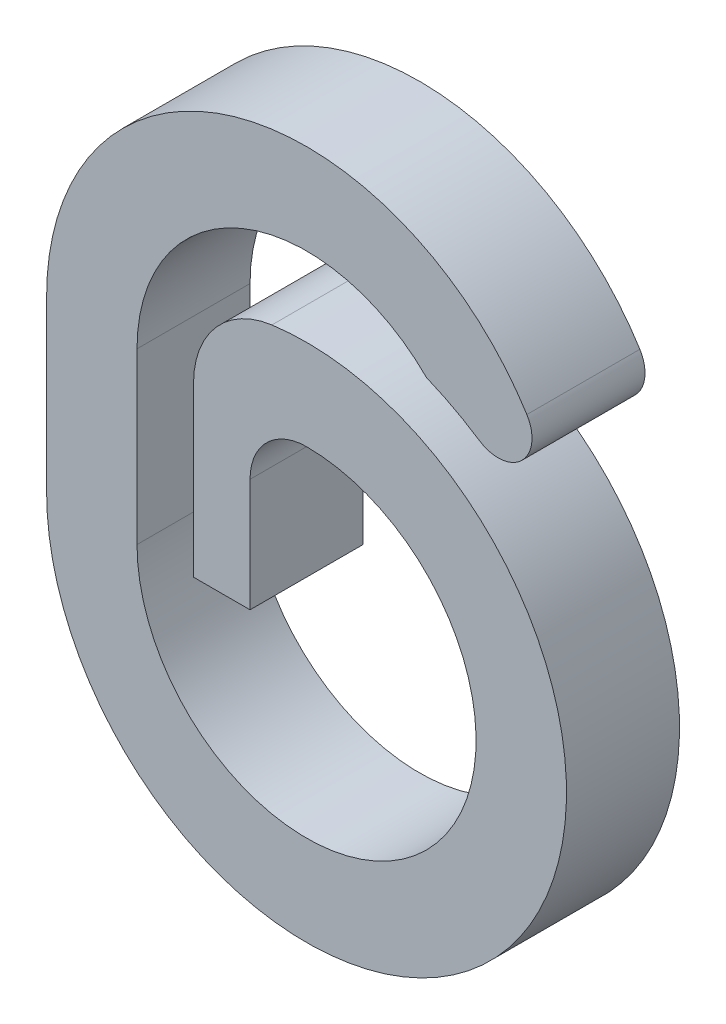
ISO-10303-21;
HEADER;
FILE_DESCRIPTION(('STEP AP214'),'2;1');
FILE_NAME('part.step','',(''),(''),'','','');
FILE_SCHEMA(('AUTOMOTIVE_DESIGN { 1 0 10303 214 1 1 1 1 }'));
ENDSEC;
DATA;
#1=APPLICATION_CONTEXT('core data for automotive mechanical design processes');
#2=APPLICATION_PROTOCOL_DEFINITION('international standard','automotive_design',2000,#1);
#3=PRODUCT_CONTEXT('',#1,'mechanical');
#4=PRODUCT('Part','Part','',(#3));
#5=PRODUCT_RELATED_PRODUCT_CATEGORY('part','',(#4));
#6=PRODUCT_DEFINITION_FORMATION('','',#4);
#7=PRODUCT_DEFINITION_CONTEXT('part definition',#1,'design');
#8=PRODUCT_DEFINITION('design','',#6,#7);
#9=PRODUCT_DEFINITION_SHAPE('','',#8);
#10=(LENGTH_UNIT() NAMED_UNIT(*) SI_UNIT(.MILLI.,.METRE.));
#11=(NAMED_UNIT(*) PLANE_ANGLE_UNIT() SI_UNIT($,.RADIAN.));
#12=(NAMED_UNIT(*) SI_UNIT($,.STERADIAN.) SOLID_ANGLE_UNIT());
#13=UNCERTAINTY_MEASURE_WITH_UNIT(LENGTH_MEASURE(1.E-05),#10,'distance_accuracy_value','');
#14=(GEOMETRIC_REPRESENTATION_CONTEXT(3) GLOBAL_UNCERTAINTY_ASSIGNED_CONTEXT((#13)) GLOBAL_UNIT_ASSIGNED_CONTEXT((#10,
#11,#12)) REPRESENTATION_CONTEXT('',''));
#15=CARTESIAN_POINT('',(0.,0.,0.));
#16=DIRECTION('',(0.,0.,1.));
#17=DIRECTION('',(1.,0.,0.));
#18=AXIS2_PLACEMENT_3D('',#15,#16,#17);
#19=CARTESIAN_POINT('',(-5.,0.,10.));
#20=DIRECTION('',(-1.,0.,0.));
#21=DIRECTION('',(0.,-1.,0.));
#22=AXIS2_PLACEMENT_3D('',#19,#20,#21);
#23=PLANE('',#22);
#24=DIRECTION('',(0.,1.,0.));
#25=VECTOR('',#24,1.);
#26=CARTESIAN_POINT('',(-5.,0.,0.));
#27=LINE('',#26,#25);
#28=CARTESIAN_POINT('',(-5.,0.,0.));
#29=VERTEX_POINT('',#28);
#30=CARTESIAN_POINT('',(-5.,10.,0.));
#31=VERTEX_POINT('',#30);
#32=EDGE_CURVE('E159',#29,#31,#27,.T.);
#33=ORIENTED_EDGE('',*,*,#32,.T.);
#34=DIRECTION('',(0.,0.,-1.));
#35=VECTOR('',#34,1.);
#36=CARTESIAN_POINT('',(-5.,10.,10.));
#37=LINE('',#36,#35);
#38=CARTESIAN_POINT('',(-5.,10.,10.));
#39=VERTEX_POINT('',#38);
#40=EDGE_CURVE('E11',#39,#31,#37,.T.);
#41=ORIENTED_EDGE('',*,*,#40,.F.);
#42=DIRECTION('',(0.,1.,0.));
#43=VECTOR('',#42,1.);
#44=CARTESIAN_POINT('',(-5.,0.,10.));
#45=LINE('',#44,#43);
#46=CARTESIAN_POINT('',(-5.,0.,10.));
#47=VERTEX_POINT('',#46);
#48=EDGE_CURVE('E183',#47,#39,#45,.T.);
#49=ORIENTED_EDGE('',*,*,#48,.F.);
#50=DIRECTION('',(0.,0.,-1.));
#51=VECTOR('',#50,1.);
#52=CARTESIAN_POINT('',(-5.,0.,10.));
#53=LINE('',#52,#51);
#54=EDGE_CURVE('E155',#47,#29,#53,.T.);
#55=ORIENTED_EDGE('',*,*,#54,.T.);
#56=EDGE_LOOP('',(#33,#41,#49,#55));
#57=FACE_BOUND('',#56,.T.);
#58=ADVANCED_FACE('F33',(#57),#23,.F.);
#59=CARTESIAN_POINT('',(0.,10.,10.));
#60=DIRECTION('',(0.,0.,-1.));
#61=DIRECTION('',(-1.,0.,0.));
#62=AXIS2_PLACEMENT_3D('',#59,#60,#61);
#63=CYLINDRICAL_SURFACE('',#62,5.);
#64=CARTESIAN_POINT('',(0.,10.,0.));
#65=DIRECTION('',(0.,0.,-1.));
#66=DIRECTION('',(1.,0.,0.));
#67=AXIS2_PLACEMENT_3D('',#64,#65,#66);
#68=CIRCLE('',#67,5.);
#69=CARTESIAN_POINT('',(0.,15.,0.));
#70=VERTEX_POINT('',#69);
#71=EDGE_CURVE('E162',#31,#70,#68,.T.);
#72=ORIENTED_EDGE('',*,*,#71,.T.);
#73=DIRECTION('',(0.,0.,-1.));
#74=VECTOR('',#73,1.);
#75=CARTESIAN_POINT('',(0.,15.,10.));
#76=LINE('',#75,#74);
#77=CARTESIAN_POINT('',(0.,15.,10.));
#78=VERTEX_POINT('',#77);
#79=EDGE_CURVE('E41',#78,#70,#76,.T.);
#80=ORIENTED_EDGE('',*,*,#79,.F.);
#81=CARTESIAN_POINT('',(0.,10.,10.));
#82=DIRECTION('',(0.,0.,-1.));
#83=DIRECTION('',(1.,0.,0.));
#84=AXIS2_PLACEMENT_3D('',#81,#82,#83);
#85=CIRCLE('',#84,5.);
#86=EDGE_CURVE('E106',#39,#78,#85,.T.);
#87=ORIENTED_EDGE('',*,*,#86,.F.);
#88=ORIENTED_EDGE('',*,*,#40,.T.);
#89=EDGE_LOOP('',(#72,#80,#87,#88));
#90=FACE_BOUND('',#89,.T.);
#91=ADVANCED_FACE('F266',(#90),#63,.F.);
#92=CARTESIAN_POINT('',(0.,0.,10.));
#93=DIRECTION('',(0.,0.,-1.));
#94=DIRECTION('',(-1.,0.,0.));
#95=AXIS2_PLACEMENT_3D('',#92,#93,#94);
#96=CYLINDRICAL_SURFACE('',#95,15.);
#97=CARTESIAN_POINT('',(0.,0.,0.));
#98=DIRECTION('',(0.,0.,-1.));
#99=DIRECTION('',(1.,0.,0.));
#100=AXIS2_PLACEMENT_3D('',#97,#98,#99);
#101=CIRCLE('',#100,15.);
#102=CARTESIAN_POINT('',(-15.,0.,0.));
#103=VERTEX_POINT('',#102);
#104=EDGE_CURVE('E164',#70,#103,#101,.T.);
#105=ORIENTED_EDGE('',*,*,#104,.T.);
#106=DIRECTION('',(0.,0.,-1.));
#107=VECTOR('',#106,1.);
#108=CARTESIAN_POINT('',(-15.,0.,10.));
#109=LINE('',#108,#107);
#110=CARTESIAN_POINT('',(-15.,0.,10.));
#111=VERTEX_POINT('',#110);
#112=EDGE_CURVE('E205',#111,#103,#109,.T.);
#113=ORIENTED_EDGE('',*,*,#112,.F.);
#114=CARTESIAN_POINT('',(0.,0.,10.));
#115=DIRECTION('',(0.,0.,-1.));
#116=DIRECTION('',(1.,0.,0.));
#117=AXIS2_PLACEMENT_3D('',#114,#115,#116);
#118=CIRCLE('',#117,15.);
#119=EDGE_CURVE('E213',#78,#111,#118,.T.);
#120=ORIENTED_EDGE('',*,*,#119,.F.);
#121=ORIENTED_EDGE('',*,*,#79,.T.);
#122=EDGE_LOOP('',(#105,#113,#120,#121));
#123=FACE_BOUND('',#122,.T.);
#124=ADVANCED_FACE('F211',(#123),#96,.F.);
#125=CARTESIAN_POINT('',(-15.,15.,10.));
#126=DIRECTION('',(-1.,0.,0.));
#127=DIRECTION('',(0.,0.,1.));
#128=AXIS2_PLACEMENT_3D('',#125,#126,#127);
#129=PLANE('',#128);
#130=DIRECTION('',(0.,1.,0.));
#131=VECTOR('',#130,1.);
#132=CARTESIAN_POINT('',(-15.,15.,0.));
#133=LINE('',#132,#131);
#134=CARTESIAN_POINT('',(-15.,15.,0.));
#135=VERTEX_POINT('',#134);
#136=EDGE_CURVE('E166',#103,#135,#133,.T.);
#137=ORIENTED_EDGE('',*,*,#136,.T.);
#138=DIRECTION('',(0.,0.,-1.));
#139=VECTOR('',#138,1.);
#140=CARTESIAN_POINT('',(-15.,15.,10.));
#141=LINE('',#140,#139);
#142=CARTESIAN_POINT('',(-15.,15.,10.));
#143=VERTEX_POINT('',#142);
#144=EDGE_CURVE('E202',#143,#135,#141,.T.);
#145=ORIENTED_EDGE('',*,*,#144,.F.);
#146=DIRECTION('',(0.,1.,0.));
#147=VECTOR('',#146,1.);
#148=CARTESIAN_POINT('',(-15.,15.,10.));
#149=LINE('',#148,#147);
#150=EDGE_CURVE('E231',#111,#143,#149,.T.);
#151=ORIENTED_EDGE('',*,*,#150,.F.);
#152=ORIENTED_EDGE('',*,*,#112,.T.);
#153=EDGE_LOOP('',(#137,#145,#151,#152));
#154=FACE_BOUND('',#153,.T.);
#155=ADVANCED_FACE('F222',(#154),#129,.F.);
#156=CARTESIAN_POINT('',(0.,15.,10.));
#157=DIRECTION('',(0.,0.,-1.));
#158=DIRECTION('',(-1.,0.,0.));
#159=AXIS2_PLACEMENT_3D('',#156,#157,#158);
#160=CYLINDRICAL_SURFACE('',#159,15.);
#161=CARTESIAN_POINT('',(0.,15.,0.));
#162=DIRECTION('',(0.,0.,-1.));
#163=DIRECTION('',(1.,0.,0.));
#164=AXIS2_PLACEMENT_3D('',#161,#162,#163);
#165=CIRCLE('',#164,15.);
#166=CARTESIAN_POINT('',(10.6066017177982,25.6066017177982,0.));
#167=VERTEX_POINT('',#166);
#168=EDGE_CURVE('E168',#135,#167,#165,.T.);
#169=ORIENTED_EDGE('',*,*,#168,.T.);
#170=DIRECTION('',(0.,0.,-1.));
#171=VECTOR('',#170,1.);
#172=CARTESIAN_POINT('',(10.6066017177982,25.6066017177982,10.));
#173=LINE('',#172,#171);
#174=CARTESIAN_POINT('',(10.6066017177982,25.6066017177982,10.));
#175=VERTEX_POINT('',#174);
#176=EDGE_CURVE('E199',#175,#167,#173,.T.);
#177=ORIENTED_EDGE('',*,*,#176,.F.);
#178=CARTESIAN_POINT('',(0.,15.,10.));
#179=DIRECTION('',(0.,0.,-1.));
#180=DIRECTION('',(1.,0.,0.));
#181=AXIS2_PLACEMENT_3D('',#178,#179,#180);
#182=CIRCLE('',#181,15.);
#183=EDGE_CURVE('E228',#143,#175,#182,.T.);
#184=ORIENTED_EDGE('',*,*,#183,.F.);
#185=ORIENTED_EDGE('',*,*,#144,.T.);
#186=EDGE_LOOP('',(#169,#177,#184,#185));
#187=FACE_BOUND('',#186,.T.);
#188=ADVANCED_FACE('F226',(#187),#160,.F.);
#189=CARTESIAN_POINT('',(0.,0.,10.));
#190=DIRECTION('',(0.,0.,-1.));
#191=DIRECTION('',(-1.,0.,0.));
#192=AXIS2_PLACEMENT_3D('',#189,#190,#191);
#193=CYLINDRICAL_SURFACE('',#192,27.7163859753386);
#194=CARTESIAN_POINT('',(0.,0.,0.));
#195=DIRECTION('',(0.,0.,-1.));
#196=DIRECTION('',(1.,0.,0.));
#197=AXIS2_PLACEMENT_3D('',#194,#195,#196);
#198=CIRCLE('',#197,27.7163859753386);
#199=CARTESIAN_POINT('',(15.2941714006203,23.114635465488,0.));
#200=VERTEX_POINT('',#199);
#201=EDGE_CURVE('E170',#167,#200,#198,.T.);
#202=ORIENTED_EDGE('',*,*,#201,.T.);
#203=DIRECTION('',(0.,0.,-1.));
#204=VECTOR('',#203,1.);
#205=CARTESIAN_POINT('',(15.2941714006203,23.114635465488,10.));
#206=LINE('',#205,#204);
#207=CARTESIAN_POINT('',(15.2941714006203,23.114635465488,10.));
#208=VERTEX_POINT('',#207);
#209=EDGE_CURVE('E196',#208,#200,#206,.T.);
#210=ORIENTED_EDGE('',*,*,#209,.F.);
#211=CARTESIAN_POINT('',(0.,0.,10.));
#212=DIRECTION('',(0.,0.,-1.));
#213=DIRECTION('',(1.,0.,0.));
#214=AXIS2_PLACEMENT_3D('',#211,#212,#213);
#215=CIRCLE('',#214,27.7163859753386);
#216=EDGE_CURVE('E230',#175,#208,#215,.T.);
#217=ORIENTED_EDGE('',*,*,#216,.F.);
#218=ORIENTED_EDGE('',*,*,#176,.T.);
#219=EDGE_LOOP('',(#202,#210,#217,#218));
#220=FACE_BOUND('',#219,.T.);
#221=ADVANCED_FACE('F279',(#220),#193,.F.);
#222=CARTESIAN_POINT('',(16.9496005840169,25.6165455795326,10.));
#223=DIRECTION('',(0.,0.,-1.));
#224=DIRECTION('',(-1.,0.,0.));
#225=AXIS2_PLACEMENT_3D('',#222,#223,#224);
#226=CYLINDRICAL_SURFACE('',#225,3.);
#227=CARTESIAN_POINT('',(16.9496005840169,25.6165455795326,0.));
#228=DIRECTION('',(0.,0.,1.));
#229=DIRECTION('',(1.,0.,0.));
#230=AXIS2_PLACEMENT_3D('',#227,#228,#229);
#231=CIRCLE('',#230,3.);
#232=CARTESIAN_POINT('',(19.4920406716195,27.2090274164625,0.));
#233=VERTEX_POINT('',#232);
#234=EDGE_CURVE('E172',#200,#233,#231,.T.);
#235=ORIENTED_EDGE('',*,*,#234,.T.);
#236=DIRECTION('',(0.,0.,-1.));
#237=VECTOR('',#236,1.);
#238=CARTESIAN_POINT('',(19.4920406716195,27.2090274164625,10.));
#239=LINE('',#238,#237);
#240=CARTESIAN_POINT('',(19.4920406716195,27.2090274164625,10.));
#241=VERTEX_POINT('',#240);
#242=EDGE_CURVE('E193',#241,#233,#239,.T.);
#243=ORIENTED_EDGE('',*,*,#242,.F.);
#244=CARTESIAN_POINT('',(16.9496005840169,25.6165455795326,10.));
#245=DIRECTION('',(0.,0.,1.));
#246=DIRECTION('',(1.,0.,0.));
#247=AXIS2_PLACEMENT_3D('',#244,#245,#246);
#248=CIRCLE('',#247,3.);
#249=EDGE_CURVE('E233',#208,#241,#248,.T.);
#250=ORIENTED_EDGE('',*,*,#249,.F.);
#251=ORIENTED_EDGE('',*,*,#209,.T.);
#252=EDGE_LOOP('',(#235,#243,#250,#251));
#253=FACE_BOUND('',#252,.T.);
#254=ADVANCED_FACE('F282',(#253),#226,.T.);
#255=CARTESIAN_POINT('',(0.,15.,10.));
#256=DIRECTION('',(0.,0.,-1.));
#257=DIRECTION('',(-1.,0.,0.));
#258=AXIS2_PLACEMENT_3D('',#255,#256,#257);
#259=CYLINDRICAL_SURFACE('',#258,23.);
#260=CARTESIAN_POINT('',(0.,15.,0.));
#261=DIRECTION('',(0.,0.,1.));
#262=DIRECTION('',(1.,0.,0.));
#263=AXIS2_PLACEMENT_3D('',#260,#261,#262);
#264=CIRCLE('',#263,23.);
#265=CARTESIAN_POINT('',(-23.,15.,0.));
#266=VERTEX_POINT('',#265);
#267=EDGE_CURVE('E174',#233,#266,#264,.T.);
#268=ORIENTED_EDGE('',*,*,#267,.T.);
#269=DIRECTION('',(0.,0.,-1.));
#270=VECTOR('',#269,1.);
#271=CARTESIAN_POINT('',(-23.,15.,10.));
#272=LINE('',#271,#270);
#273=CARTESIAN_POINT('',(-23.,15.,10.));
#274=VERTEX_POINT('',#273);
#275=EDGE_CURVE('E190',#274,#266,#272,.T.);
#276=ORIENTED_EDGE('',*,*,#275,.F.);
#277=CARTESIAN_POINT('',(0.,15.,10.));
#278=DIRECTION('',(0.,0.,1.));
#279=DIRECTION('',(1.,0.,0.));
#280=AXIS2_PLACEMENT_3D('',#277,#278,#279);
#281=CIRCLE('',#280,23.);
#282=EDGE_CURVE('E239',#241,#274,#281,.T.);
#283=ORIENTED_EDGE('',*,*,#282,.F.);
#284=ORIENTED_EDGE('',*,*,#242,.T.);
#285=EDGE_LOOP('',(#268,#276,#283,#284));
#286=FACE_BOUND('',#285,.T.);
#287=ADVANCED_FACE('F286',(#286),#259,.T.);
#288=CARTESIAN_POINT('',(-23.,0.,10.));
#289=DIRECTION('',(1.,0.,0.));
#290=DIRECTION('',(0.,1.,0.));
#291=AXIS2_PLACEMENT_3D('',#288,#289,#290);
#292=PLANE('',#291);
#293=DIRECTION('',(0.,-1.,0.));
#294=VECTOR('',#293,1.);
#295=CARTESIAN_POINT('',(-23.,0.,0.));
#296=LINE('',#295,#294);
#297=CARTESIAN_POINT('',(-23.,0.,0.));
#298=VERTEX_POINT('',#297);
#299=EDGE_CURVE('E176',#266,#298,#296,.T.);
#300=ORIENTED_EDGE('',*,*,#299,.T.);
#301=DIRECTION('',(0.,0.,-1.));
#302=VECTOR('',#301,1.);
#303=CARTESIAN_POINT('',(-23.,0.,10.));
#304=LINE('',#303,#302);
#305=CARTESIAN_POINT('',(-23.,0.,10.));
#306=VERTEX_POINT('',#305);
#307=EDGE_CURVE('E187',#306,#298,#304,.T.);
#308=ORIENTED_EDGE('',*,*,#307,.F.);
#309=DIRECTION('',(0.,-1.,0.));
#310=VECTOR('',#309,1.);
#311=CARTESIAN_POINT('',(-23.,0.,10.));
#312=LINE('',#311,#310);
#313=EDGE_CURVE('E241',#274,#306,#312,.T.);
#314=ORIENTED_EDGE('',*,*,#313,.F.);
#315=ORIENTED_EDGE('',*,*,#275,.T.);
#316=EDGE_LOOP('',(#300,#308,#314,#315));
#317=FACE_BOUND('',#316,.T.);
#318=ADVANCED_FACE('F247',(#317),#292,.F.);
#319=CARTESIAN_POINT('',(0.,0.,10.));
#320=DIRECTION('',(0.,0.,-1.));
#321=DIRECTION('',(-1.,0.,0.));
#322=AXIS2_PLACEMENT_3D('',#319,#320,#321);
#323=CYLINDRICAL_SURFACE('',#322,23.);
#324=CARTESIAN_POINT('',(0.,0.,0.));
#325=DIRECTION('',(0.,0.,1.));
#326=DIRECTION('',(1.,0.,0.));
#327=AXIS2_PLACEMENT_3D('',#324,#325,#326);
#328=CIRCLE('',#327,23.);
#329=CARTESIAN_POINT('',(-3.06666666666667,22.7946387458884,0.));
#330=VERTEX_POINT('',#329);
#331=EDGE_CURVE('E178',#298,#330,#328,.T.);
#332=ORIENTED_EDGE('',*,*,#331,.T.);
#333=DIRECTION('',(0.,0.,-1.));
#334=VECTOR('',#333,1.);
#335=CARTESIAN_POINT('',(-3.06666666666667,22.7946387458884,10.));
#336=LINE('',#335,#334);
#337=CARTESIAN_POINT('',(-3.06666666666667,22.7946387458884,10.));
#338=VERTEX_POINT('',#337);
#339=EDGE_CURVE('E150',#338,#330,#336,.T.);
#340=ORIENTED_EDGE('',*,*,#339,.F.);
#341=CARTESIAN_POINT('',(0.,0.,10.));
#342=DIRECTION('',(0.,0.,1.));
#343=DIRECTION('',(1.,0.,0.));
#344=AXIS2_PLACEMENT_3D('',#341,#342,#343);
#345=CIRCLE('',#344,23.);
#346=EDGE_CURVE('E140',#306,#338,#345,.T.);
#347=ORIENTED_EDGE('',*,*,#346,.F.);
#348=ORIENTED_EDGE('',*,*,#307,.T.);
#349=EDGE_LOOP('',(#332,#340,#347,#348));
#350=FACE_BOUND('',#349,.T.);
#351=ADVANCED_FACE('F251',(#350),#323,.T.);
#352=CARTESIAN_POINT('',(-2.,14.8660687473185,10.));
#353=DIRECTION('',(0.,0.,-1.));
#354=DIRECTION('',(-1.,0.,0.));
#355=AXIS2_PLACEMENT_3D('',#352,#353,#354);
#356=CYLINDRICAL_SURFACE('',#355,8.);
#357=CARTESIAN_POINT('',(-2.,14.8660687473185,0.));
#358=DIRECTION('',(0.,0.,1.));
#359=DIRECTION('',(-1.,0.,0.));
#360=AXIS2_PLACEMENT_3D('',#357,#358,#359);
#361=CIRCLE('',#360,8.);
#362=CARTESIAN_POINT('',(-10.,14.8660687473185,0.));
#363=VERTEX_POINT('',#362);
#364=EDGE_CURVE('E149',#330,#363,#361,.T.);
#365=ORIENTED_EDGE('',*,*,#364,.T.);
#366=DIRECTION('',(0.,0.,-1.));
#367=VECTOR('',#366,1.);
#368=CARTESIAN_POINT('',(-10.,14.8660687473185,10.));
#369=LINE('',#368,#367);
#370=CARTESIAN_POINT('',(-10.,14.8660687473185,10.));
#371=VERTEX_POINT('',#370);
#372=EDGE_CURVE('E146',#371,#363,#369,.T.);
#373=ORIENTED_EDGE('',*,*,#372,.F.);
#374=CARTESIAN_POINT('',(-2.,14.8660687473185,10.));
#375=DIRECTION('',(0.,0.,1.));
#376=DIRECTION('',(-1.,0.,0.));
#377=AXIS2_PLACEMENT_3D('',#374,#375,#376);
#378=CIRCLE('',#377,8.);
#379=EDGE_CURVE('E134',#338,#371,#378,.T.);
#380=ORIENTED_EDGE('',*,*,#379,.F.);
#381=ORIENTED_EDGE('',*,*,#339,.T.);
#382=EDGE_LOOP('',(#365,#373,#380,#381));
#383=FACE_BOUND('',#382,.T.);
#384=ADVANCED_FACE('F147',(#383),#356,.T.);
#385=CARTESIAN_POINT('',(-10.,11.1803398874989,10.));
#386=DIRECTION('',(1.,0.,0.));
#387=DIRECTION('',(0.,1.,0.));
#388=AXIS2_PLACEMENT_3D('',#385,#386,#387);
#389=PLANE('',#388);
#390=DIRECTION('',(0.,-1.,0.));
#391=VECTOR('',#390,1.);
#392=CARTESIAN_POINT('',(-10.,11.1803398874989,0.));
#393=LINE('',#392,#391);
#394=CARTESIAN_POINT('',(-10.,0.,0.));
#395=VERTEX_POINT('',#394);
#396=EDGE_CURVE('E92',#363,#395,#393,.T.);
#397=ORIENTED_EDGE('',*,*,#396,.T.);
#398=DIRECTION('',(0.,0.,-1.));
#399=VECTOR('',#398,1.);
#400=CARTESIAN_POINT('',(-10.,0.,10.));
#401=LINE('',#400,#399);
#402=CARTESIAN_POINT('',(-10.,0.,10.));
#403=VERTEX_POINT('',#402);
#404=EDGE_CURVE('E151',#403,#395,#401,.T.);
#405=ORIENTED_EDGE('',*,*,#404,.F.);
#406=DIRECTION('',(0.,-1.,0.));
#407=VECTOR('',#406,1.);
#408=CARTESIAN_POINT('',(-10.,14.8660687473185,10.));
#409=LINE('',#408,#407);
#410=EDGE_CURVE('E138',#371,#403,#409,.T.);
#411=ORIENTED_EDGE('',*,*,#410,.F.);
#412=ORIENTED_EDGE('',*,*,#372,.T.);
#413=EDGE_LOOP('',(#397,#405,#411,#412));
#414=FACE_BOUND('',#413,.T.);
#415=ADVANCED_FACE('F153',(#414),#389,.F.);
#416=CARTESIAN_POINT('',(-10.,0.,10.));
#417=DIRECTION('',(0.,1.,0.));
#418=DIRECTION('',(0.,0.,1.));
#419=AXIS2_PLACEMENT_3D('',#416,#417,#418);
#420=PLANE('',#419);
#421=DIRECTION('',(1.,0.,0.));
#422=VECTOR('',#421,1.);
#423=CARTESIAN_POINT('',(-10.,0.,0.));
#424=LINE('',#423,#422);
#425=EDGE_CURVE('E98',#395,#29,#424,.T.);
#426=ORIENTED_EDGE('',*,*,#425,.T.);
#427=ORIENTED_EDGE('',*,*,#54,.F.);
#428=DIRECTION('',(1.,0.,0.));
#429=VECTOR('',#428,1.);
#430=CARTESIAN_POINT('',(-10.,0.,10.));
#431=LINE('',#430,#429);
#432=EDGE_CURVE('E49',#403,#47,#431,.T.);
#433=ORIENTED_EDGE('',*,*,#432,.F.);
#434=ORIENTED_EDGE('',*,*,#404,.T.);
#435=EDGE_LOOP('',(#426,#427,#433,#434));
#436=FACE_BOUND('',#435,.T.);
#437=ADVANCED_FACE('F255',(#436),#420,.F.);
#438=CARTESIAN_POINT('',(0.,10.,10.));
#439=DIRECTION('',(0.,0.,1.));
#440=DIRECTION('',(1.,0.,0.));
#441=AXIS2_PLACEMENT_3D('',#438,#439,#440);
#442=PLANE('',#441);
#443=ORIENTED_EDGE('',*,*,#48,.T.);
#444=ORIENTED_EDGE('',*,*,#86,.T.);
#445=ORIENTED_EDGE('',*,*,#119,.T.);
#446=ORIENTED_EDGE('',*,*,#150,.T.);
#447=ORIENTED_EDGE('',*,*,#183,.T.);
#448=ORIENTED_EDGE('',*,*,#216,.T.);
#449=ORIENTED_EDGE('',*,*,#249,.T.);
#450=ORIENTED_EDGE('',*,*,#282,.T.);
#451=ORIENTED_EDGE('',*,*,#313,.T.);
#452=ORIENTED_EDGE('',*,*,#346,.T.);
#453=ORIENTED_EDGE('',*,*,#379,.T.);
#454=ORIENTED_EDGE('',*,*,#410,.T.);
#455=ORIENTED_EDGE('',*,*,#432,.T.);
#456=EDGE_LOOP('',(#443,#444,#445,#446,#447,#448,#449,#450,#451,#452,#453,#454,#455));
#457=FACE_BOUND('',#456,.T.);
#458=ADVANCED_FACE('F136',(#457),#442,.T.);
#459=CARTESIAN_POINT('',(0.,10.,0.));
#460=DIRECTION('',(0.,0.,1.));
#461=DIRECTION('',(1.,0.,0.));
#462=AXIS2_PLACEMENT_3D('',#459,#460,#461);
#463=PLANE('',#462);
#464=ORIENTED_EDGE('',*,*,#32,.F.);
#465=ORIENTED_EDGE('',*,*,#425,.F.);
#466=ORIENTED_EDGE('',*,*,#396,.F.);
#467=ORIENTED_EDGE('',*,*,#364,.F.);
#468=ORIENTED_EDGE('',*,*,#331,.F.);
#469=ORIENTED_EDGE('',*,*,#299,.F.);
#470=ORIENTED_EDGE('',*,*,#267,.F.);
#471=ORIENTED_EDGE('',*,*,#234,.F.);
#472=ORIENTED_EDGE('',*,*,#201,.F.);
#473=ORIENTED_EDGE('',*,*,#168,.F.);
#474=ORIENTED_EDGE('',*,*,#136,.F.);
#475=ORIENTED_EDGE('',*,*,#104,.F.);
#476=ORIENTED_EDGE('',*,*,#71,.F.);
#477=EDGE_LOOP('',(#464,#465,#466,#467,#468,#469,#470,#471,#472,#473,#474,#475,#476));
#478=FACE_BOUND('',#477,.T.);
#479=ADVANCED_FACE('F217',(#478),#463,.F.);
#480=CLOSED_SHELL('',(#58,#91,#124,#155,#188,#221,#254,#287,#318,#351,#384,#415,#437,#458,#479));
#481=MANIFOLD_SOLID_BREP('B2',#480);
#482=ADVANCED_BREP_SHAPE_REPRESENTATION('',(#18,#481),#14);
#483=SHAPE_DEFINITION_REPRESENTATION(#9,#482);
ENDSEC;
END-ISO-10303-21;
